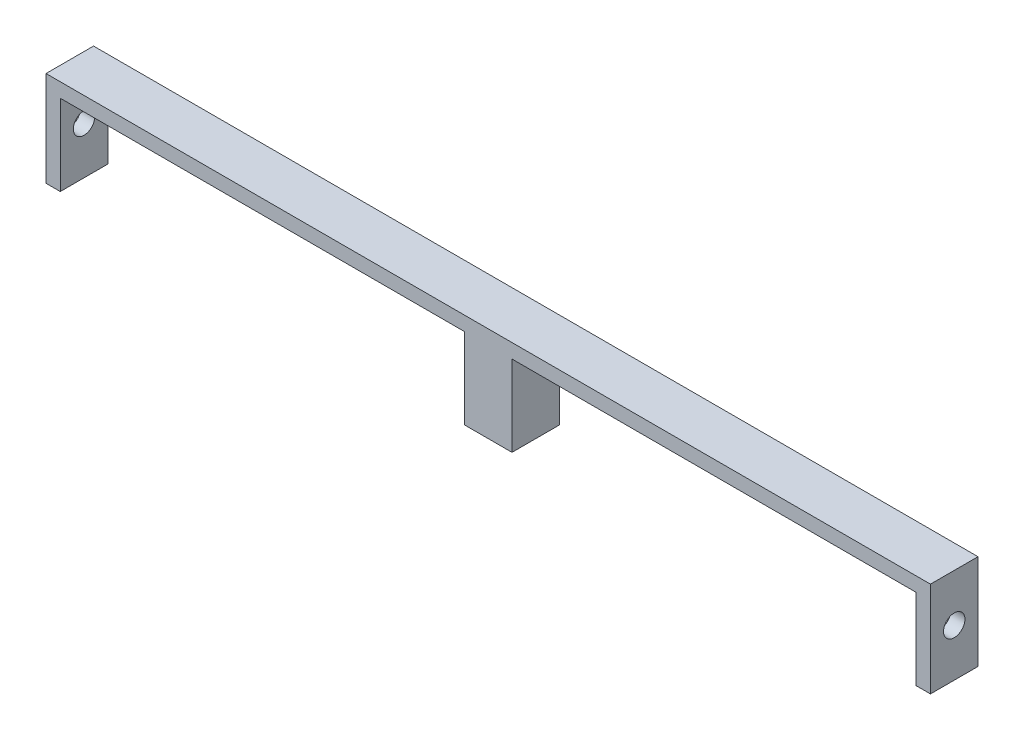
ISO-10303-21;
HEADER;
FILE_DESCRIPTION(('STEP AP214'),'2;1');
FILE_NAME('part.step','',(''),(''),'','','');
FILE_SCHEMA(('AUTOMOTIVE_DESIGN { 1 0 10303 214 1 1 1 1 }'));
ENDSEC;
DATA;
#1=APPLICATION_CONTEXT('core data for automotive mechanical design processes');
#2=APPLICATION_PROTOCOL_DEFINITION('international standard','automotive_design',2000,#1);
#3=PRODUCT_CONTEXT('',#1,'mechanical');
#4=PRODUCT('Part','Part','',(#3));
#5=PRODUCT_RELATED_PRODUCT_CATEGORY('part','',(#4));
#6=PRODUCT_DEFINITION_FORMATION('','',#4);
#7=PRODUCT_DEFINITION_CONTEXT('part definition',#1,'design');
#8=PRODUCT_DEFINITION('design','',#6,#7);
#9=PRODUCT_DEFINITION_SHAPE('','',#8);
#10=(LENGTH_UNIT() NAMED_UNIT(*) SI_UNIT(.MILLI.,.METRE.));
#11=(NAMED_UNIT(*) PLANE_ANGLE_UNIT() SI_UNIT($,.RADIAN.));
#12=(NAMED_UNIT(*) SI_UNIT($,.STERADIAN.) SOLID_ANGLE_UNIT());
#13=UNCERTAINTY_MEASURE_WITH_UNIT(LENGTH_MEASURE(1.E-05),#10,'distance_accuracy_value','');
#14=(GEOMETRIC_REPRESENTATION_CONTEXT(3) GLOBAL_UNCERTAINTY_ASSIGNED_CONTEXT((#13)) GLOBAL_UNIT_ASSIGNED_CONTEXT((#10,
#11,#12)) REPRESENTATION_CONTEXT('',''));
#15=CARTESIAN_POINT('',(0.,0.,0.));
#16=DIRECTION('',(0.,0.,1.));
#17=DIRECTION('',(1.,0.,0.));
#18=AXIS2_PLACEMENT_3D('',#15,#16,#17);
#19=CARTESIAN_POINT('',(27.5654019183431,19.6890756302521,10.));
#20=DIRECTION('',(1.,0.,0.));
#21=DIRECTION('',(0.,1.,0.));
#22=AXIS2_PLACEMENT_3D('',#19,#20,#21);
#23=PLANE('',#22);
#24=DIRECTION('',(0.,-1.,0.));
#25=VECTOR('',#24,1.);
#26=CARTESIAN_POINT('',(27.5654019183431,19.6890756302521,0.));
#27=LINE('',#26,#25);
#28=CARTESIAN_POINT('',(27.5654019183431,19.6890756302521,0.));
#29=VERTEX_POINT('',#28);
#30=CARTESIAN_POINT('',(27.5654019183431,2.68907563025209,0.));
#31=VERTEX_POINT('',#30);
#32=EDGE_CURVE('E155',#29,#31,#27,.T.);
#33=ORIENTED_EDGE('',*,*,#32,.T.);
#34=DIRECTION('',(0.,0.,-1.));
#35=VECTOR('',#34,1.);
#36=CARTESIAN_POINT('',(27.5654019183431,2.68907563025209,10.));
#37=LINE('',#36,#35);
#38=CARTESIAN_POINT('',(27.5654019183431,2.68907563025209,10.));
#39=VERTEX_POINT('',#38);
#40=EDGE_CURVE('E11',#39,#31,#37,.T.);
#41=ORIENTED_EDGE('',*,*,#40,.F.);
#42=DIRECTION('',(0.,-1.,0.));
#43=VECTOR('',#42,1.);
#44=CARTESIAN_POINT('',(27.5654019183431,19.6890756302521,10.));
#45=LINE('',#44,#43);
#46=CARTESIAN_POINT('',(27.5654019183431,19.6890756302521,10.));
#47=VERTEX_POINT('',#46);
#48=EDGE_CURVE('E178',#47,#39,#45,.T.);
#49=ORIENTED_EDGE('',*,*,#48,.F.);
#50=DIRECTION('',(0.,0.,-1.));
#51=VECTOR('',#50,1.);
#52=CARTESIAN_POINT('',(27.5654019183431,19.6890756302521,10.));
#53=LINE('',#52,#51);
#54=EDGE_CURVE('E151',#47,#29,#53,.T.);
#55=ORIENTED_EDGE('',*,*,#54,.T.);
#56=EDGE_LOOP('',(#33,#41,#49,#55));
#57=FACE_BOUND('',#56,.T.);
#58=ADVANCED_FACE('F33',(#57),#23,.F.);
#59=CARTESIAN_POINT('',(27.5654019183431,2.68907563025209,10.));
#60=DIRECTION('',(0.,1.,0.));
#61=DIRECTION('',(0.,0.,1.));
#62=AXIS2_PLACEMENT_3D('',#59,#60,#61);
#63=PLANE('',#62);
#64=DIRECTION('',(1.,0.,0.));
#65=VECTOR('',#64,1.);
#66=CARTESIAN_POINT('',(27.5654019183431,2.68907563025209,0.));
#67=LINE('',#66,#65);
#68=CARTESIAN_POINT('',(37.5654019183431,2.68907563025209,0.));
#69=VERTEX_POINT('',#68);
#70=EDGE_CURVE('E158',#31,#69,#67,.T.);
#71=ORIENTED_EDGE('',*,*,#70,.T.);
#72=DIRECTION('',(0.,0.,-1.));
#73=VECTOR('',#72,1.);
#74=CARTESIAN_POINT('',(37.5654019183431,2.68907563025209,10.));
#75=LINE('',#74,#73);
#76=CARTESIAN_POINT('',(37.5654019183431,2.68907563025209,10.));
#77=VERTEX_POINT('',#76);
#78=EDGE_CURVE('E42',#77,#69,#75,.T.);
#79=ORIENTED_EDGE('',*,*,#78,.F.);
#80=DIRECTION('',(1.,0.,0.));
#81=VECTOR('',#80,1.);
#82=CARTESIAN_POINT('',(27.5654019183431,2.68907563025209,10.));
#83=LINE('',#82,#81);
#84=EDGE_CURVE('E106',#39,#77,#83,.T.);
#85=ORIENTED_EDGE('',*,*,#84,.F.);
#86=ORIENTED_EDGE('',*,*,#40,.T.);
#87=EDGE_LOOP('',(#71,#79,#85,#86));
#88=FACE_BOUND('',#87,.T.);
#89=ADVANCED_FACE('F254',(#88),#63,.F.);
#90=CARTESIAN_POINT('',(37.5654019183431,19.6890756302521,10.));
#91=DIRECTION('',(-1.,0.,0.));
#92=DIRECTION('',(0.,0.,1.));
#93=AXIS2_PLACEMENT_3D('',#90,#91,#92);
#94=PLANE('',#93);
#95=DIRECTION('',(0.,1.,0.));
#96=VECTOR('',#95,1.);
#97=CARTESIAN_POINT('',(37.5654019183431,19.6890756302521,0.));
#98=LINE('',#97,#96);
#99=CARTESIAN_POINT('',(37.5654019183431,19.6890756302521,0.));
#100=VERTEX_POINT('',#99);
#101=EDGE_CURVE('E161',#69,#100,#98,.T.);
#102=ORIENTED_EDGE('',*,*,#101,.T.);
#103=DIRECTION('',(0.,0.,-1.));
#104=VECTOR('',#103,1.);
#105=CARTESIAN_POINT('',(37.5654019183431,19.6890756302521,10.));
#106=LINE('',#105,#104);
#107=CARTESIAN_POINT('',(37.5654019183431,19.6890756302521,10.));
#108=VERTEX_POINT('',#107);
#109=EDGE_CURVE('E197',#108,#100,#106,.T.);
#110=ORIENTED_EDGE('',*,*,#109,.F.);
#111=DIRECTION('',(0.,1.,0.));
#112=VECTOR('',#111,1.);
#113=CARTESIAN_POINT('',(37.5654019183431,19.6890756302521,10.));
#114=LINE('',#113,#112);
#115=EDGE_CURVE('E215',#77,#108,#114,.T.);
#116=ORIENTED_EDGE('',*,*,#115,.F.);
#117=ORIENTED_EDGE('',*,*,#78,.T.);
#118=EDGE_LOOP('',(#102,#110,#116,#117));
#119=FACE_BOUND('',#118,.T.);
#120=ADVANCED_FACE('F258',(#119),#94,.F.);
#121=CARTESIAN_POINT('',(122.565401918343,19.6890756302521,10.));
#122=DIRECTION('',(0.,1.,0.));
#123=DIRECTION('',(-1.,0.,0.));
#124=AXIS2_PLACEMENT_3D('',#121,#122,#123);
#125=PLANE('',#124);
#126=DIRECTION('',(1.,0.,0.));
#127=VECTOR('',#126,1.);
#128=CARTESIAN_POINT('',(122.565401918343,19.6890756302521,0.));
#129=LINE('',#128,#127);
#130=CARTESIAN_POINT('',(122.565401918343,19.6890756302521,0.));
#131=VERTEX_POINT('',#130);
#132=EDGE_CURVE('E163',#100,#131,#129,.T.);
#133=ORIENTED_EDGE('',*,*,#132,.T.);
#134=DIRECTION('',(0.,0.,-1.));
#135=VECTOR('',#134,1.);
#136=CARTESIAN_POINT('',(122.565401918343,19.6890756302521,10.));
#137=LINE('',#136,#135);
#138=CARTESIAN_POINT('',(122.565401918343,19.6890756302521,10.));
#139=VERTEX_POINT('',#138);
#140=EDGE_CURVE('E194',#139,#131,#137,.T.);
#141=ORIENTED_EDGE('',*,*,#140,.F.);
#142=DIRECTION('',(1.,0.,0.));
#143=VECTOR('',#142,1.);
#144=CARTESIAN_POINT('',(122.565401918343,19.6890756302521,10.));
#145=LINE('',#144,#143);
#146=EDGE_CURVE('E217',#108,#139,#145,.T.);
#147=ORIENTED_EDGE('',*,*,#146,.F.);
#148=ORIENTED_EDGE('',*,*,#109,.T.);
#149=EDGE_LOOP('',(#133,#141,#147,#148));
#150=FACE_BOUND('',#149,.T.);
#151=ADVANCED_FACE('F262',(#150),#125,.F.);
#152=CARTESIAN_POINT('',(122.565401918343,2.68907563025212,10.));
#153=DIRECTION('',(1.,0.,0.));
#154=DIRECTION('',(0.,0.,-1.));
#155=AXIS2_PLACEMENT_3D('',#152,#153,#154);
#156=PLANE('',#155);
#157=CARTESIAN_POINT('',(122.565401918343,12.6890756302521,5.));
#158=DIRECTION('',(1.,0.,0.));
#159=DIRECTION('',(0.,0.,-1.));
#160=AXIS2_PLACEMENT_3D('',#157,#158,#159);
#161=CIRCLE('',#160,2.25);
#162=CARTESIAN_POINT('',(122.565401918343,12.6890756302521,2.75));
#163=VERTEX_POINT('',#162);
#164=EDGE_CURVE('E210',#163,#163,#161,.T.);
#165=ORIENTED_EDGE('',*,*,#164,.T.);
#166=EDGE_LOOP('',(#165));
#167=FACE_BOUND('',#166,.T.);
#168=DIRECTION('',(0.,-1.,0.));
#169=VECTOR('',#168,1.);
#170=CARTESIAN_POINT('',(122.565401918343,2.68907563025212,0.));
#171=LINE('',#170,#169);
#172=CARTESIAN_POINT('',(122.565401918343,2.68907563025212,0.));
#173=VERTEX_POINT('',#172);
#174=EDGE_CURVE('E165',#131,#173,#171,.T.);
#175=ORIENTED_EDGE('',*,*,#174,.T.);
#176=DIRECTION('',(0.,0.,-1.));
#177=VECTOR('',#176,1.);
#178=CARTESIAN_POINT('',(122.565401918343,2.68907563025212,10.));
#179=LINE('',#178,#177);
#180=CARTESIAN_POINT('',(122.565401918343,2.68907563025212,10.));
#181=VERTEX_POINT('',#180);
#182=EDGE_CURVE('E191',#181,#173,#179,.T.);
#183=ORIENTED_EDGE('',*,*,#182,.F.);
#184=DIRECTION('',(0.,-1.,0.));
#185=VECTOR('',#184,1.);
#186=CARTESIAN_POINT('',(122.565401918343,2.68907563025212,10.));
#187=LINE('',#186,#185);
#188=EDGE_CURVE('E219',#139,#181,#187,.T.);
#189=ORIENTED_EDGE('',*,*,#188,.F.);
#190=ORIENTED_EDGE('',*,*,#140,.T.);
#191=EDGE_LOOP('',(#175,#183,#189,#190));
#192=FACE_BOUND('',#191,.T.);
#193=ADVANCED_FACE('F268',(#167,#192),#156,.F.);
#194=CARTESIAN_POINT('',(125.565401918343,2.68907563025212,10.));
#195=DIRECTION('',(0.,1.,0.));
#196=DIRECTION('',(-1.,0.,0.));
#197=AXIS2_PLACEMENT_3D('',#194,#195,#196);
#198=PLANE('',#197);
#199=DIRECTION('',(1.,0.,0.));
#200=VECTOR('',#199,1.);
#201=CARTESIAN_POINT('',(125.565401918343,2.68907563025212,0.));
#202=LINE('',#201,#200);
#203=CARTESIAN_POINT('',(125.565401918343,2.68907563025212,0.));
#204=VERTEX_POINT('',#203);
#205=EDGE_CURVE('E167',#173,#204,#202,.T.);
#206=ORIENTED_EDGE('',*,*,#205,.T.);
#207=DIRECTION('',(0.,0.,-1.));
#208=VECTOR('',#207,1.);
#209=CARTESIAN_POINT('',(125.565401918343,2.68907563025212,10.));
#210=LINE('',#209,#208);
#211=CARTESIAN_POINT('',(125.565401918343,2.68907563025212,10.));
#212=VERTEX_POINT('',#211);
#213=EDGE_CURVE('E188',#212,#204,#210,.T.);
#214=ORIENTED_EDGE('',*,*,#213,.F.);
#215=DIRECTION('',(1.,0.,0.));
#216=VECTOR('',#215,1.);
#217=CARTESIAN_POINT('',(125.565401918343,2.68907563025212,10.));
#218=LINE('',#217,#216);
#219=EDGE_CURVE('E221',#181,#212,#218,.T.);
#220=ORIENTED_EDGE('',*,*,#219,.F.);
#221=ORIENTED_EDGE('',*,*,#182,.T.);
#222=EDGE_LOOP('',(#206,#214,#220,#221));
#223=FACE_BOUND('',#222,.T.);
#224=ADVANCED_FACE('F272',(#223),#198,.F.);
#225=CARTESIAN_POINT('',(125.565401918343,22.6890756302521,10.));
#226=DIRECTION('',(-1.,0.,0.));
#227=DIRECTION('',(0.,0.,1.));
#228=AXIS2_PLACEMENT_3D('',#225,#226,#227);
#229=PLANE('',#228);
#230=CARTESIAN_POINT('',(125.565401918343,12.6890756302521,5.));
#231=DIRECTION('',(-1.,0.,0.));
#232=DIRECTION('',(0.,0.,1.));
#233=AXIS2_PLACEMENT_3D('',#230,#231,#232);
#234=CIRCLE('',#233,2.25);
#235=CARTESIAN_POINT('',(125.565401918343,12.6890756302521,7.25));
#236=VERTEX_POINT('',#235);
#237=EDGE_CURVE('E36',#236,#236,#234,.F.);
#238=ORIENTED_EDGE('',*,*,#237,.F.);
#239=EDGE_LOOP('',(#238));
#240=FACE_BOUND('',#239,.T.);
#241=DIRECTION('',(0.,1.,0.));
#242=VECTOR('',#241,1.);
#243=CARTESIAN_POINT('',(125.565401918343,22.6890756302521,0.));
#244=LINE('',#243,#242);
#245=CARTESIAN_POINT('',(125.565401918343,22.6890756302521,0.));
#246=VERTEX_POINT('',#245);
#247=EDGE_CURVE('E169',#204,#246,#244,.T.);
#248=ORIENTED_EDGE('',*,*,#247,.T.);
#249=DIRECTION('',(0.,0.,-1.));
#250=VECTOR('',#249,1.);
#251=CARTESIAN_POINT('',(125.565401918343,22.6890756302521,10.));
#252=LINE('',#251,#250);
#253=CARTESIAN_POINT('',(125.565401918343,22.6890756302521,10.));
#254=VERTEX_POINT('',#253);
#255=EDGE_CURVE('E185',#254,#246,#252,.T.);
#256=ORIENTED_EDGE('',*,*,#255,.F.);
#257=DIRECTION('',(0.,1.,0.));
#258=VECTOR('',#257,1.);
#259=CARTESIAN_POINT('',(125.565401918343,22.6890756302521,10.));
#260=LINE('',#259,#258);
#261=EDGE_CURVE('E223',#212,#254,#260,.T.);
#262=ORIENTED_EDGE('',*,*,#261,.F.);
#263=ORIENTED_EDGE('',*,*,#213,.T.);
#264=EDGE_LOOP('',(#248,#256,#262,#263));
#265=FACE_BOUND('',#264,.T.);
#266=ADVANCED_FACE('F276',(#240,#265),#229,.F.);
#267=CARTESIAN_POINT('',(-60.4345980816569,22.6890756302521,10.));
#268=DIRECTION('',(0.,-1.,0.));
#269=DIRECTION('',(1.,0.,0.));
#270=AXIS2_PLACEMENT_3D('',#267,#268,#269);
#271=PLANE('',#270);
#272=DIRECTION('',(-1.,0.,0.));
#273=VECTOR('',#272,1.);
#274=CARTESIAN_POINT('',(-60.4345980816569,22.6890756302521,0.));
#275=LINE('',#274,#273);
#276=CARTESIAN_POINT('',(-60.4345980816569,22.6890756302521,0.));
#277=VERTEX_POINT('',#276);
#278=EDGE_CURVE('E171',#246,#277,#275,.T.);
#279=ORIENTED_EDGE('',*,*,#278,.T.);
#280=DIRECTION('',(0.,0.,-1.));
#281=VECTOR('',#280,1.);
#282=CARTESIAN_POINT('',(-60.4345980816569,22.6890756302521,10.));
#283=LINE('',#282,#281);
#284=CARTESIAN_POINT('',(-60.4345980816569,22.6890756302521,10.));
#285=VERTEX_POINT('',#284);
#286=EDGE_CURVE('E182',#285,#277,#283,.T.);
#287=ORIENTED_EDGE('',*,*,#286,.F.);
#288=DIRECTION('',(-1.,0.,0.));
#289=VECTOR('',#288,1.);
#290=CARTESIAN_POINT('',(-60.4345980816569,22.6890756302521,10.));
#291=LINE('',#290,#289);
#292=EDGE_CURVE('E225',#254,#285,#291,.T.);
#293=ORIENTED_EDGE('',*,*,#292,.F.);
#294=ORIENTED_EDGE('',*,*,#255,.T.);
#295=EDGE_LOOP('',(#279,#287,#293,#294));
#296=FACE_BOUND('',#295,.T.);
#297=ADVANCED_FACE('F231',(#296),#271,.F.);
#298=CARTESIAN_POINT('',(-60.4345980816569,2.68907563025209,10.));
#299=DIRECTION('',(1.,0.,0.));
#300=DIRECTION('',(0.,0.,-1.));
#301=AXIS2_PLACEMENT_3D('',#298,#299,#300);
#302=PLANE('',#301);
#303=CARTESIAN_POINT('',(-60.4345980816569,12.6890756302521,5.));
#304=DIRECTION('',(-1.,0.,0.));
#305=DIRECTION('',(0.,0.,1.));
#306=AXIS2_PLACEMENT_3D('',#303,#304,#305);
#307=CIRCLE('',#306,2.25);
#308=CARTESIAN_POINT('',(-60.4345980816569,12.6890756302521,7.25));
#309=VERTEX_POINT('',#308);
#310=EDGE_CURVE('E202',#309,#309,#307,.T.);
#311=ORIENTED_EDGE('',*,*,#310,.F.);
#312=EDGE_LOOP('',(#311));
#313=FACE_BOUND('',#312,.T.);
#314=DIRECTION('',(0.,-1.,0.));
#315=VECTOR('',#314,1.);
#316=CARTESIAN_POINT('',(-60.4345980816569,2.68907563025209,0.));
#317=LINE('',#316,#315);
#318=CARTESIAN_POINT('',(-60.4345980816569,2.68907563025209,0.));
#319=VERTEX_POINT('',#318);
#320=EDGE_CURVE('E173',#277,#319,#317,.T.);
#321=ORIENTED_EDGE('',*,*,#320,.T.);
#322=DIRECTION('',(0.,0.,-1.));
#323=VECTOR('',#322,1.);
#324=CARTESIAN_POINT('',(-60.4345980816569,2.68907563025209,10.));
#325=LINE('',#324,#323);
#326=CARTESIAN_POINT('',(-60.4345980816569,2.68907563025209,10.));
#327=VERTEX_POINT('',#326);
#328=EDGE_CURVE('E146',#327,#319,#325,.T.);
#329=ORIENTED_EDGE('',*,*,#328,.F.);
#330=DIRECTION('',(0.,-1.,0.));
#331=VECTOR('',#330,1.);
#332=CARTESIAN_POINT('',(-60.4345980816569,2.68907563025209,10.));
#333=LINE('',#332,#331);
#334=EDGE_CURVE('E137',#285,#327,#333,.T.);
#335=ORIENTED_EDGE('',*,*,#334,.F.);
#336=ORIENTED_EDGE('',*,*,#286,.T.);
#337=EDGE_LOOP('',(#321,#329,#335,#336));
#338=FACE_BOUND('',#337,.T.);
#339=ADVANCED_FACE('F235',(#313,#338),#302,.F.);
#340=CARTESIAN_POINT('',(-57.4345980816569,2.68907563025209,10.));
#341=DIRECTION('',(0.,1.,0.));
#342=DIRECTION('',(-1.,0.,0.));
#343=AXIS2_PLACEMENT_3D('',#340,#341,#342);
#344=PLANE('',#343);
#345=DIRECTION('',(1.,0.,0.));
#346=VECTOR('',#345,1.);
#347=CARTESIAN_POINT('',(-57.4345980816569,2.68907563025209,0.));
#348=LINE('',#347,#346);
#349=CARTESIAN_POINT('',(-57.4345980816569,2.68907563025209,0.));
#350=VERTEX_POINT('',#349);
#351=EDGE_CURVE('E145',#319,#350,#348,.T.);
#352=ORIENTED_EDGE('',*,*,#351,.T.);
#353=DIRECTION('',(0.,0.,-1.));
#354=VECTOR('',#353,1.);
#355=CARTESIAN_POINT('',(-57.4345980816569,2.68907563025209,10.));
#356=LINE('',#355,#354);
#357=CARTESIAN_POINT('',(-57.4345980816569,2.68907563025209,10.));
#358=VERTEX_POINT('',#357);
#359=EDGE_CURVE('E142',#358,#350,#356,.T.);
#360=ORIENTED_EDGE('',*,*,#359,.F.);
#361=DIRECTION('',(1.,0.,0.));
#362=VECTOR('',#361,1.);
#363=CARTESIAN_POINT('',(-57.4345980816569,2.68907563025209,10.));
#364=LINE('',#363,#362);
#365=EDGE_CURVE('E131',#327,#358,#364,.T.);
#366=ORIENTED_EDGE('',*,*,#365,.F.);
#367=ORIENTED_EDGE('',*,*,#328,.T.);
#368=EDGE_LOOP('',(#352,#360,#366,#367));
#369=FACE_BOUND('',#368,.T.);
#370=ADVANCED_FACE('F143',(#369),#344,.F.);
#371=CARTESIAN_POINT('',(-57.4345980816569,19.6890756302521,10.));
#372=DIRECTION('',(-1.,0.,0.));
#373=DIRECTION('',(0.,0.,1.));
#374=AXIS2_PLACEMENT_3D('',#371,#372,#373);
#375=PLANE('',#374);
#376=CARTESIAN_POINT('',(-57.4345980816569,12.6890756302521,5.));
#377=DIRECTION('',(-1.,0.,0.));
#378=DIRECTION('',(0.,0.,1.));
#379=AXIS2_PLACEMENT_3D('',#376,#377,#378);
#380=CIRCLE('',#379,2.25);
#381=CARTESIAN_POINT('',(-57.4345980816569,12.6890756302521,7.25));
#382=VERTEX_POINT('',#381);
#383=EDGE_CURVE('E159',#382,#382,#380,.T.);
#384=ORIENTED_EDGE('',*,*,#383,.T.);
#385=EDGE_LOOP('',(#384));
#386=FACE_BOUND('',#385,.T.);
#387=DIRECTION('',(0.,1.,0.));
#388=VECTOR('',#387,1.);
#389=CARTESIAN_POINT('',(-57.4345980816569,19.6890756302521,0.));
#390=LINE('',#389,#388);
#391=CARTESIAN_POINT('',(-57.4345980816569,19.6890756302521,0.));
#392=VERTEX_POINT('',#391);
#393=EDGE_CURVE('E92',#350,#392,#390,.T.);
#394=ORIENTED_EDGE('',*,*,#393,.T.);
#395=DIRECTION('',(0.,0.,-1.));
#396=VECTOR('',#395,1.);
#397=CARTESIAN_POINT('',(-57.4345980816569,19.6890756302521,10.));
#398=LINE('',#397,#396);
#399=CARTESIAN_POINT('',(-57.4345980816569,19.6890756302521,10.));
#400=VERTEX_POINT('',#399);
#401=EDGE_CURVE('E147',#400,#392,#398,.T.);
#402=ORIENTED_EDGE('',*,*,#401,.F.);
#403=DIRECTION('',(0.,1.,0.));
#404=VECTOR('',#403,1.);
#405=CARTESIAN_POINT('',(-57.4345980816569,19.6890756302521,10.));
#406=LINE('',#405,#404);
#407=EDGE_CURVE('E135',#358,#400,#406,.T.);
#408=ORIENTED_EDGE('',*,*,#407,.F.);
#409=ORIENTED_EDGE('',*,*,#359,.T.);
#410=EDGE_LOOP('',(#394,#402,#408,#409));
#411=FACE_BOUND('',#410,.T.);
#412=ADVANCED_FACE('F149',(#386,#411),#375,.F.);
#413=CARTESIAN_POINT('',(27.5654019183431,19.6890756302521,10.));
#414=DIRECTION('',(0.,1.,0.));
#415=DIRECTION('',(-1.,0.,0.));
#416=AXIS2_PLACEMENT_3D('',#413,#414,#415);
#417=PLANE('',#416);
#418=DIRECTION('',(1.,0.,0.));
#419=VECTOR('',#418,1.);
#420=CARTESIAN_POINT('',(27.5654019183431,19.6890756302521,0.));
#421=LINE('',#420,#419);
#422=EDGE_CURVE('E98',#392,#29,#421,.T.);
#423=ORIENTED_EDGE('',*,*,#422,.T.);
#424=ORIENTED_EDGE('',*,*,#54,.F.);
#425=DIRECTION('',(1.,0.,0.));
#426=VECTOR('',#425,1.);
#427=CARTESIAN_POINT('',(27.5654019183431,19.6890756302521,10.));
#428=LINE('',#427,#426);
#429=EDGE_CURVE('E51',#400,#47,#428,.T.);
#430=ORIENTED_EDGE('',*,*,#429,.F.);
#431=ORIENTED_EDGE('',*,*,#401,.T.);
#432=EDGE_LOOP('',(#423,#424,#430,#431));
#433=FACE_BOUND('',#432,.T.);
#434=ADVANCED_FACE('F243',(#433),#417,.F.);
#435=CARTESIAN_POINT('',(0.,0.,10.));
#436=DIRECTION('',(0.,0.,1.));
#437=DIRECTION('',(1.,0.,0.));
#438=AXIS2_PLACEMENT_3D('',#435,#436,#437);
#439=PLANE('',#438);
#440=ORIENTED_EDGE('',*,*,#48,.T.);
#441=ORIENTED_EDGE('',*,*,#84,.T.);
#442=ORIENTED_EDGE('',*,*,#115,.T.);
#443=ORIENTED_EDGE('',*,*,#146,.T.);
#444=ORIENTED_EDGE('',*,*,#188,.T.);
#445=ORIENTED_EDGE('',*,*,#219,.T.);
#446=ORIENTED_EDGE('',*,*,#261,.T.);
#447=ORIENTED_EDGE('',*,*,#292,.T.);
#448=ORIENTED_EDGE('',*,*,#334,.T.);
#449=ORIENTED_EDGE('',*,*,#365,.T.);
#450=ORIENTED_EDGE('',*,*,#407,.T.);
#451=ORIENTED_EDGE('',*,*,#429,.T.);
#452=EDGE_LOOP('',(#440,#441,#442,#443,#444,#445,#446,#447,#448,#449,#450,#451));
#453=FACE_BOUND('',#452,.T.);
#454=ADVANCED_FACE('F133',(#453),#439,.T.);
#455=CARTESIAN_POINT('',(0.,0.,0.));
#456=DIRECTION('',(0.,0.,1.));
#457=DIRECTION('',(1.,0.,0.));
#458=AXIS2_PLACEMENT_3D('',#455,#456,#457);
#459=PLANE('',#458);
#460=ORIENTED_EDGE('',*,*,#32,.F.);
#461=ORIENTED_EDGE('',*,*,#422,.F.);
#462=ORIENTED_EDGE('',*,*,#393,.F.);
#463=ORIENTED_EDGE('',*,*,#351,.F.);
#464=ORIENTED_EDGE('',*,*,#320,.F.);
#465=ORIENTED_EDGE('',*,*,#278,.F.);
#466=ORIENTED_EDGE('',*,*,#247,.F.);
#467=ORIENTED_EDGE('',*,*,#205,.F.);
#468=ORIENTED_EDGE('',*,*,#174,.F.);
#469=ORIENTED_EDGE('',*,*,#132,.F.);
#470=ORIENTED_EDGE('',*,*,#101,.F.);
#471=ORIENTED_EDGE('',*,*,#70,.F.);
#472=EDGE_LOOP('',(#460,#461,#462,#463,#464,#465,#466,#467,#468,#469,#470,#471));
#473=FACE_BOUND('',#472,.T.);
#474=ADVANCED_FACE('F238',(#473),#459,.F.);
#475=CARTESIAN_POINT('',(-50.4345980816569,12.6890756302521,5.));
#476=DIRECTION('',(-1.,0.,0.));
#477=DIRECTION('',(0.,0.,1.));
#478=AXIS2_PLACEMENT_3D('',#475,#476,#477);
#479=CYLINDRICAL_SURFACE('',#478,2.25);
#480=ORIENTED_EDGE('',*,*,#310,.T.);
#481=EDGE_LOOP('',(#480));
#482=FACE_BOUND('',#481,.T.);
#483=ORIENTED_EDGE('',*,*,#383,.F.);
#484=EDGE_LOOP('',(#483));
#485=FACE_BOUND('',#484,.T.);
#486=ADVANCED_FACE('F305',(#482,#485),#479,.F.);
#487=CARTESIAN_POINT('',(132.565401918343,12.6890756302521,5.));
#488=DIRECTION('',(-1.,0.,0.));
#489=DIRECTION('',(0.,0.,1.));
#490=AXIS2_PLACEMENT_3D('',#487,#488,#489);
#491=CYLINDRICAL_SURFACE('',#490,2.25);
#492=ORIENTED_EDGE('',*,*,#164,.F.);
#493=EDGE_LOOP('',(#492));
#494=FACE_BOUND('',#493,.T.);
#495=ORIENTED_EDGE('',*,*,#237,.T.);
#496=EDGE_LOOP('',(#495));
#497=FACE_BOUND('',#496,.T.);
#498=ADVANCED_FACE('F310',(#494,#497),#491,.F.);
#499=CLOSED_SHELL('',(#58,#89,#120,#151,#193,#224,#266,#297,#339,#370,#412,#434,#454,#474,#486,#498));
#500=MANIFOLD_SOLID_BREP('B2',#499);
#501=ADVANCED_BREP_SHAPE_REPRESENTATION('',(#18,#500),#14);
#502=SHAPE_DEFINITION_REPRESENTATION(#9,#501);
ENDSEC;
END-ISO-10303-21;
